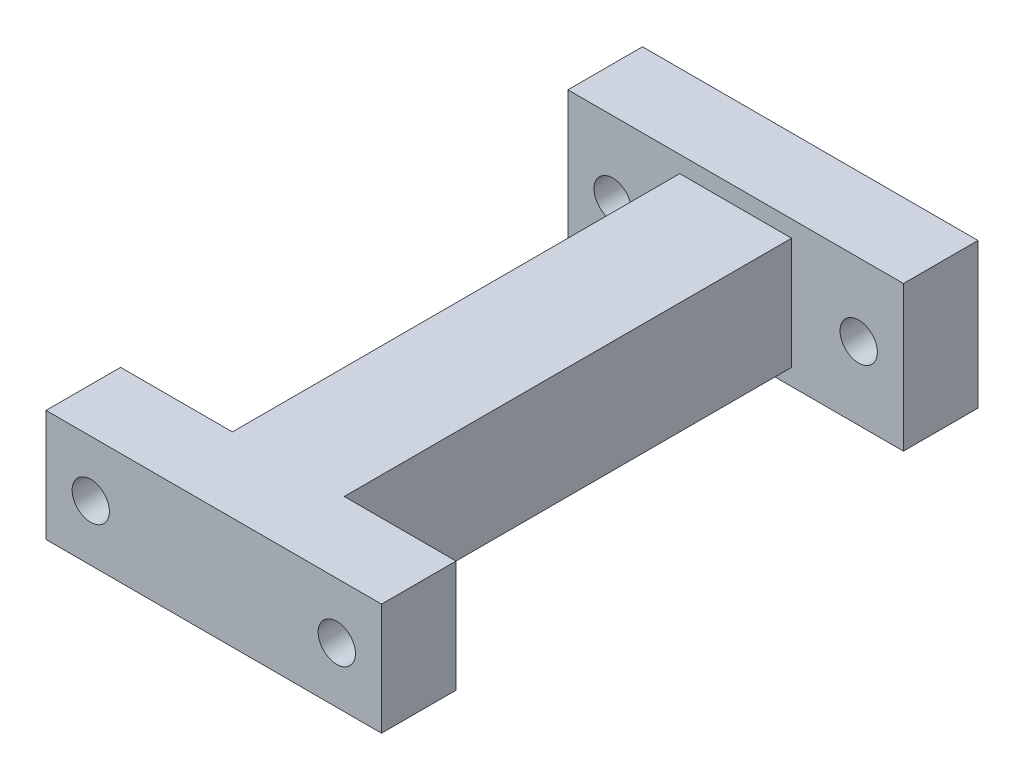
ISO-10303-21;
HEADER;
FILE_DESCRIPTION(('STEP AP214'),'2;1');
FILE_NAME('part.step','',(''),(''),'','','');
FILE_SCHEMA(('AUTOMOTIVE_DESIGN { 1 0 10303 214 1 1 1 1 }'));
ENDSEC;
DATA;
#1=APPLICATION_CONTEXT('core data for automotive mechanical design processes');
#2=APPLICATION_PROTOCOL_DEFINITION('international standard','automotive_design',2000,#1);
#3=PRODUCT_CONTEXT('',#1,'mechanical');
#4=PRODUCT('Part','Part','',(#3));
#5=PRODUCT_RELATED_PRODUCT_CATEGORY('part','',(#4));
#6=PRODUCT_DEFINITION_FORMATION('','',#4);
#7=PRODUCT_DEFINITION_CONTEXT('part definition',#1,'design');
#8=PRODUCT_DEFINITION('design','',#6,#7);
#9=PRODUCT_DEFINITION_SHAPE('','',#8);
#10=(LENGTH_UNIT() NAMED_UNIT(*) SI_UNIT(.MILLI.,.METRE.));
#11=(NAMED_UNIT(*) PLANE_ANGLE_UNIT() SI_UNIT($,.RADIAN.));
#12=(NAMED_UNIT(*) SI_UNIT($,.STERADIAN.) SOLID_ANGLE_UNIT());
#13=UNCERTAINTY_MEASURE_WITH_UNIT(LENGTH_MEASURE(1.E-05),#10,'distance_accuracy_value','');
#14=(GEOMETRIC_REPRESENTATION_CONTEXT(3) GLOBAL_UNCERTAINTY_ASSIGNED_CONTEXT((#13)) GLOBAL_UNIT_ASSIGNED_CONTEXT((#10,
#11,#12)) REPRESENTATION_CONTEXT('',''));
#15=CARTESIAN_POINT('',(0.,0.,0.));
#16=DIRECTION('',(0.,0.,1.));
#17=DIRECTION('',(1.,0.,0.));
#18=AXIS2_PLACEMENT_3D('',#15,#16,#17);
#19=CARTESIAN_POINT('',(-7.5,-7.5,80.));
#20=DIRECTION('',(1.,0.,0.));
#21=DIRECTION('',(0.,0.,-1.));
#22=AXIS2_PLACEMENT_3D('',#19,#20,#21);
#23=PLANE('',#22);
#24=DIRECTION('',(0.,1.,0.));
#25=VECTOR('',#24,1.);
#26=CARTESIAN_POINT('',(-7.5,-7.5,9.99999999999999));
#27=LINE('',#26,#25);
#28=CARTESIAN_POINT('',(-7.5,-7.5,9.99999999999999));
#29=VERTEX_POINT('',#28);
#30=CARTESIAN_POINT('',(-7.5,7.5,9.99999999999999));
#31=VERTEX_POINT('',#30);
#32=EDGE_CURVE('E66',#29,#31,#27,.T.);
#33=ORIENTED_EDGE('',*,*,#32,.F.);
#34=DIRECTION('',(0.,0.,-1.));
#35=VECTOR('',#34,1.);
#36=CARTESIAN_POINT('',(-7.5,-7.5,80.));
#37=LINE('',#36,#35);
#38=CARTESIAN_POINT('',(-7.49999999999999,-7.5,70.));
#39=VERTEX_POINT('',#38);
#40=EDGE_CURVE('E51',#39,#29,#37,.T.);
#41=ORIENTED_EDGE('',*,*,#40,.F.);
#42=DIRECTION('',(0.,-1.,0.));
#43=VECTOR('',#42,1.);
#44=CARTESIAN_POINT('',(-7.5,-7.5,70.));
#45=LINE('',#44,#43);
#46=CARTESIAN_POINT('',(-7.49999999999999,7.5,70.));
#47=VERTEX_POINT('',#46);
#48=EDGE_CURVE('E256',#47,#39,#45,.T.);
#49=ORIENTED_EDGE('',*,*,#48,.F.);
#50=DIRECTION('',(0.,0.,-1.));
#51=VECTOR('',#50,1.);
#52=CARTESIAN_POINT('',(-7.5,7.5,80.));
#53=LINE('',#52,#51);
#54=EDGE_CURVE('E265',#47,#31,#53,.T.);
#55=ORIENTED_EDGE('',*,*,#54,.T.);
#56=EDGE_LOOP('',(#33,#41,#49,#55));
#57=FACE_BOUND('',#56,.T.);
#58=ADVANCED_FACE('F43',(#57),#23,.F.);
#59=CARTESIAN_POINT('',(7.5,-7.5,80.));
#60=DIRECTION('',(-1.,0.,0.));
#61=DIRECTION('',(0.,0.,1.));
#62=AXIS2_PLACEMENT_3D('',#59,#60,#61);
#63=PLANE('',#62);
#64=DIRECTION('',(0.,-1.,0.));
#65=VECTOR('',#64,1.);
#66=CARTESIAN_POINT('',(7.5,-7.5,9.99999999999999));
#67=LINE('',#66,#65);
#68=CARTESIAN_POINT('',(7.5,7.5,9.99999999999999));
#69=VERTEX_POINT('',#68);
#70=CARTESIAN_POINT('',(7.5,-7.5,9.99999999999999));
#71=VERTEX_POINT('',#70);
#72=EDGE_CURVE('E188',#69,#71,#67,.T.);
#73=ORIENTED_EDGE('',*,*,#72,.F.);
#74=DIRECTION('',(0.,0.,-1.));
#75=VECTOR('',#74,1.);
#76=CARTESIAN_POINT('',(7.5,7.5,80.));
#77=LINE('',#76,#75);
#78=CARTESIAN_POINT('',(7.5,7.5,70.));
#79=VERTEX_POINT('',#78);
#80=EDGE_CURVE('E268',#79,#69,#77,.T.);
#81=ORIENTED_EDGE('',*,*,#80,.F.);
#82=DIRECTION('',(0.,1.,0.));
#83=VECTOR('',#82,1.);
#84=CARTESIAN_POINT('',(7.5,-7.5,70.));
#85=LINE('',#84,#83);
#86=CARTESIAN_POINT('',(7.5,-7.5,70.));
#87=VERTEX_POINT('',#86);
#88=EDGE_CURVE('E242',#87,#79,#85,.T.);
#89=ORIENTED_EDGE('',*,*,#88,.F.);
#90=DIRECTION('',(0.,0.,-1.));
#91=VECTOR('',#90,1.);
#92=CARTESIAN_POINT('',(7.5,-7.5,80.));
#93=LINE('',#92,#91);
#94=EDGE_CURVE('E271',#87,#71,#93,.T.);
#95=ORIENTED_EDGE('',*,*,#94,.T.);
#96=EDGE_LOOP('',(#73,#81,#89,#95));
#97=FACE_BOUND('',#96,.T.);
#98=ADVANCED_FACE('F301',(#97),#63,.F.);
#99=CARTESIAN_POINT('',(7.5,-7.5,80.));
#100=DIRECTION('',(0.,1.,0.));
#101=DIRECTION('',(-1.,0.,0.));
#102=AXIS2_PLACEMENT_3D('',#99,#100,#101);
#103=PLANE('',#102);
#104=DIRECTION('',(-1.,0.,0.));
#105=VECTOR('',#104,1.);
#106=CARTESIAN_POINT('',(7.5,-7.5,9.99999999999999));
#107=LINE('',#106,#105);
#108=EDGE_CURVE('E58',#71,#29,#107,.T.);
#109=ORIENTED_EDGE('',*,*,#108,.F.);
#110=ORIENTED_EDGE('',*,*,#94,.F.);
#111=DIRECTION('',(1.,0.,0.));
#112=VECTOR('',#111,1.);
#113=CARTESIAN_POINT('',(22.5,-7.5,70.));
#114=LINE('',#113,#112);
#115=CARTESIAN_POINT('',(22.5,-7.5,70.));
#116=VERTEX_POINT('',#115);
#117=EDGE_CURVE('E214',#87,#116,#114,.T.);
#118=ORIENTED_EDGE('',*,*,#117,.T.);
#119=DIRECTION('',(0.,0.,1.));
#120=VECTOR('',#119,1.);
#121=CARTESIAN_POINT('',(22.5,-7.5,70.));
#122=LINE('',#121,#120);
#123=CARTESIAN_POINT('',(22.5,-7.5,80.));
#124=VERTEX_POINT('',#123);
#125=EDGE_CURVE('E247',#116,#124,#122,.T.);
#126=ORIENTED_EDGE('',*,*,#125,.T.);
#127=DIRECTION('',(1.,0.,0.));
#128=VECTOR('',#127,1.);
#129=CARTESIAN_POINT('',(7.5,-7.5,80.));
#130=LINE('',#129,#128);
#131=CARTESIAN_POINT('',(-22.5,-7.5,80.));
#132=VERTEX_POINT('',#131);
#133=EDGE_CURVE('E259',#132,#124,#130,.T.);
#134=ORIENTED_EDGE('',*,*,#133,.F.);
#135=DIRECTION('',(0.,0.,1.));
#136=VECTOR('',#135,1.);
#137=CARTESIAN_POINT('',(-22.5,-7.5,70.));
#138=LINE('',#137,#136);
#139=CARTESIAN_POINT('',(-22.5,-7.5,70.));
#140=VERTEX_POINT('',#139);
#141=EDGE_CURVE('E229',#140,#132,#138,.T.);
#142=ORIENTED_EDGE('',*,*,#141,.F.);
#143=EDGE_CURVE('E216',#140,#39,#114,.T.);
#144=ORIENTED_EDGE('',*,*,#143,.T.);
#145=ORIENTED_EDGE('',*,*,#40,.T.);
#146=EDGE_LOOP('',(#109,#110,#118,#126,#134,#142,#144,#145));
#147=FACE_BOUND('',#146,.T.);
#148=ADVANCED_FACE('F305',(#147),#103,.F.);
#149=CARTESIAN_POINT('',(7.5,7.5,80.));
#150=DIRECTION('',(0.,-1.,0.));
#151=DIRECTION('',(1.,0.,0.));
#152=AXIS2_PLACEMENT_3D('',#149,#150,#151);
#153=PLANE('',#152);
#154=DIRECTION('',(1.,0.,0.));
#155=VECTOR('',#154,1.);
#156=CARTESIAN_POINT('',(7.5,7.5,9.99999999999999));
#157=LINE('',#156,#155);
#158=EDGE_CURVE('E11',#31,#69,#157,.T.);
#159=ORIENTED_EDGE('',*,*,#158,.F.);
#160=ORIENTED_EDGE('',*,*,#54,.F.);
#161=DIRECTION('',(-1.,0.,0.));
#162=VECTOR('',#161,1.);
#163=CARTESIAN_POINT('',(22.5,7.5,70.));
#164=LINE('',#163,#162);
#165=CARTESIAN_POINT('',(-22.5,7.5,70.));
#166=VERTEX_POINT('',#165);
#167=EDGE_CURVE('E224',#47,#166,#164,.T.);
#168=ORIENTED_EDGE('',*,*,#167,.T.);
#169=DIRECTION('',(0.,0.,1.));
#170=VECTOR('',#169,1.);
#171=CARTESIAN_POINT('',(-22.5,7.5,70.));
#172=LINE('',#171,#170);
#173=CARTESIAN_POINT('',(-22.5,7.5,80.));
#174=VERTEX_POINT('',#173);
#175=EDGE_CURVE('E238',#166,#174,#172,.T.);
#176=ORIENTED_EDGE('',*,*,#175,.T.);
#177=DIRECTION('',(-1.,0.,0.));
#178=VECTOR('',#177,1.);
#179=CARTESIAN_POINT('',(7.5,7.5,80.));
#180=LINE('',#179,#178);
#181=CARTESIAN_POINT('',(22.5,7.5,80.));
#182=VERTEX_POINT('',#181);
#183=EDGE_CURVE('E262',#182,#174,#180,.T.);
#184=ORIENTED_EDGE('',*,*,#183,.F.);
#185=DIRECTION('',(0.,0.,1.));
#186=VECTOR('',#185,1.);
#187=CARTESIAN_POINT('',(22.5,7.5,70.));
#188=LINE('',#187,#186);
#189=CARTESIAN_POINT('',(22.5,7.5,70.));
#190=VERTEX_POINT('',#189);
#191=EDGE_CURVE('E243',#190,#182,#188,.T.);
#192=ORIENTED_EDGE('',*,*,#191,.F.);
#193=EDGE_CURVE('E225',#190,#79,#164,.T.);
#194=ORIENTED_EDGE('',*,*,#193,.T.);
#195=ORIENTED_EDGE('',*,*,#80,.T.);
#196=EDGE_LOOP('',(#159,#160,#168,#176,#184,#192,#194,#195));
#197=FACE_BOUND('',#196,.T.);
#198=ADVANCED_FACE('F311',(#197),#153,.F.);
#199=CARTESIAN_POINT('',(0.,0.,80.));
#200=DIRECTION('',(0.,0.,1.));
#201=DIRECTION('',(1.,0.,0.));
#202=AXIS2_PLACEMENT_3D('',#199,#200,#201);
#203=PLANE('',#202);
#204=CARTESIAN_POINT('',(-16.5,0.,80.));
#205=DIRECTION('',(0.,0.,1.));
#206=DIRECTION('',(1.,0.,0.));
#207=AXIS2_PLACEMENT_3D('',#204,#205,#206);
#208=CIRCLE('',#207,2.5);
#209=CARTESIAN_POINT('',(-14.,0.,80.));
#210=VERTEX_POINT('',#209);
#211=EDGE_CURVE('E202',#210,#210,#208,.T.);
#212=ORIENTED_EDGE('',*,*,#211,.F.);
#213=EDGE_LOOP('',(#212));
#214=FACE_BOUND('',#213,.T.);
#215=CARTESIAN_POINT('',(16.5,0.,80.));
#216=DIRECTION('',(0.,0.,1.));
#217=DIRECTION('',(-1.,0.,0.));
#218=AXIS2_PLACEMENT_3D('',#215,#216,#217);
#219=CIRCLE('',#218,2.5);
#220=CARTESIAN_POINT('',(14.,0.,80.));
#221=VERTEX_POINT('',#220);
#222=EDGE_CURVE('E201',#221,#221,#219,.T.);
#223=ORIENTED_EDGE('',*,*,#222,.F.);
#224=EDGE_LOOP('',(#223));
#225=FACE_BOUND('',#224,.T.);
#226=ORIENTED_EDGE('',*,*,#183,.T.);
#227=DIRECTION('',(0.,-1.,0.));
#228=VECTOR('',#227,1.);
#229=CARTESIAN_POINT('',(-22.5,-7.5,80.));
#230=LINE('',#229,#228);
#231=EDGE_CURVE('E230',#174,#132,#230,.T.);
#232=ORIENTED_EDGE('',*,*,#231,.T.);
#233=ORIENTED_EDGE('',*,*,#133,.T.);
#234=DIRECTION('',(0.,1.,0.));
#235=VECTOR('',#234,1.);
#236=CARTESIAN_POINT('',(22.5,-7.5,80.));
#237=LINE('',#236,#235);
#238=EDGE_CURVE('E215',#124,#182,#237,.T.);
#239=ORIENTED_EDGE('',*,*,#238,.T.);
#240=EDGE_LOOP('',(#226,#232,#233,#239));
#241=FACE_BOUND('',#240,.T.);
#242=ADVANCED_FACE('F316',(#214,#225,#241),#203,.T.);
#243=CARTESIAN_POINT('',(22.5,-7.5,70.));
#244=DIRECTION('',(1.,0.,0.));
#245=DIRECTION('',(0.,0.,-1.));
#246=AXIS2_PLACEMENT_3D('',#243,#244,#245);
#247=PLANE('',#246);
#248=ORIENTED_EDGE('',*,*,#238,.F.);
#249=ORIENTED_EDGE('',*,*,#125,.F.);
#250=DIRECTION('',(0.,1.,0.));
#251=VECTOR('',#250,1.);
#252=CARTESIAN_POINT('',(22.5,-7.5,70.));
#253=LINE('',#252,#251);
#254=EDGE_CURVE('E220',#116,#190,#253,.T.);
#255=ORIENTED_EDGE('',*,*,#254,.T.);
#256=ORIENTED_EDGE('',*,*,#191,.T.);
#257=EDGE_LOOP('',(#248,#249,#255,#256));
#258=FACE_BOUND('',#257,.T.);
#259=ADVANCED_FACE('F325',(#258),#247,.T.);
#260=CARTESIAN_POINT('',(0.,0.,70.));
#261=DIRECTION('',(0.,0.,1.));
#262=DIRECTION('',(1.,0.,0.));
#263=AXIS2_PLACEMENT_3D('',#260,#261,#262);
#264=PLANE('',#263);
#265=CARTESIAN_POINT('',(16.5,0.,70.));
#266=DIRECTION('',(0.,0.,1.));
#267=DIRECTION('',(1.,0.,0.));
#268=AXIS2_PLACEMENT_3D('',#265,#266,#267);
#269=CIRCLE('',#268,2.5);
#270=CARTESIAN_POINT('',(19.,0.,70.));
#271=VERTEX_POINT('',#270);
#272=EDGE_CURVE('E234',#271,#271,#269,.T.);
#273=ORIENTED_EDGE('',*,*,#272,.T.);
#274=EDGE_LOOP('',(#273));
#275=FACE_BOUND('',#274,.T.);
#276=ORIENTED_EDGE('',*,*,#117,.F.);
#277=ORIENTED_EDGE('',*,*,#88,.T.);
#278=ORIENTED_EDGE('',*,*,#193,.F.);
#279=ORIENTED_EDGE('',*,*,#254,.F.);
#280=EDGE_LOOP('',(#276,#277,#278,#279));
#281=FACE_BOUND('',#280,.T.);
#282=ADVANCED_FACE('F282',(#275,#281),#264,.F.);
#283=CARTESIAN_POINT('',(-16.5,0.,70.));
#284=DIRECTION('',(0.,0.,1.));
#285=DIRECTION('',(1.,0.,0.));
#286=AXIS2_PLACEMENT_3D('',#283,#284,#285);
#287=CIRCLE('',#286,2.5);
#288=CARTESIAN_POINT('',(-14.,0.,70.));
#289=VERTEX_POINT('',#288);
#290=EDGE_CURVE('E206',#289,#289,#287,.T.);
#291=ORIENTED_EDGE('',*,*,#290,.T.);
#292=EDGE_LOOP('',(#291));
#293=FACE_BOUND('',#292,.T.);
#294=ORIENTED_EDGE('',*,*,#167,.F.);
#295=ORIENTED_EDGE('',*,*,#48,.T.);
#296=ORIENTED_EDGE('',*,*,#143,.F.);
#297=DIRECTION('',(0.,-1.,0.));
#298=VECTOR('',#297,1.);
#299=CARTESIAN_POINT('',(-22.5,-7.5,70.));
#300=LINE('',#299,#298);
#301=EDGE_CURVE('E210',#166,#140,#300,.T.);
#302=ORIENTED_EDGE('',*,*,#301,.F.);
#303=EDGE_LOOP('',(#294,#295,#296,#302));
#304=FACE_BOUND('',#303,.T.);
#305=ADVANCED_FACE('F329',(#293,#304),#264,.F.);
#306=CARTESIAN_POINT('',(-22.5,-7.5,70.));
#307=DIRECTION('',(-1.,0.,0.));
#308=DIRECTION('',(0.,0.,1.));
#309=AXIS2_PLACEMENT_3D('',#306,#307,#308);
#310=PLANE('',#309);
#311=ORIENTED_EDGE('',*,*,#231,.F.);
#312=ORIENTED_EDGE('',*,*,#175,.F.);
#313=ORIENTED_EDGE('',*,*,#301,.T.);
#314=ORIENTED_EDGE('',*,*,#141,.T.);
#315=EDGE_LOOP('',(#311,#312,#313,#314));
#316=FACE_BOUND('',#315,.T.);
#317=ADVANCED_FACE('F296',(#316),#310,.T.);
#318=CARTESIAN_POINT('',(-16.5,0.,60.));
#319=DIRECTION('',(0.,0.,1.));
#320=DIRECTION('',(1.,0.,0.));
#321=AXIS2_PLACEMENT_3D('',#318,#319,#320);
#322=CYLINDRICAL_SURFACE('',#321,2.5);
#323=ORIENTED_EDGE('',*,*,#211,.T.);
#324=EDGE_LOOP('',(#323));
#325=FACE_BOUND('',#324,.T.);
#326=ORIENTED_EDGE('',*,*,#290,.F.);
#327=EDGE_LOOP('',(#326));
#328=FACE_BOUND('',#327,.T.);
#329=ADVANCED_FACE('F287',(#325,#328),#322,.F.);
#330=CARTESIAN_POINT('',(16.5,0.,60.));
#331=DIRECTION('',(0.,0.,1.));
#332=DIRECTION('',(1.,0.,0.));
#333=AXIS2_PLACEMENT_3D('',#330,#331,#332);
#334=CYLINDRICAL_SURFACE('',#333,2.5);
#335=ORIENTED_EDGE('',*,*,#222,.T.);
#336=EDGE_LOOP('',(#335));
#337=FACE_BOUND('',#336,.T.);
#338=ORIENTED_EDGE('',*,*,#272,.F.);
#339=EDGE_LOOP('',(#338));
#340=FACE_BOUND('',#339,.T.);
#341=ADVANCED_FACE('F285',(#337,#340),#334,.F.);
#342=CARTESIAN_POINT('',(0.,0.,10.));
#343=DIRECTION('',(0.,0.,-1.));
#344=DIRECTION('',(-1.,0.,0.));
#345=AXIS2_PLACEMENT_3D('',#342,#343,#344);
#346=PLANE('',#345);
#347=CARTESIAN_POINT('',(16.5,0.,9.99999999999999));
#348=DIRECTION('',(0.,0.,-1.));
#349=DIRECTION('',(-1.,0.,0.));
#350=AXIS2_PLACEMENT_3D('',#347,#348,#349);
#351=CIRCLE('',#350,2.5);
#352=CARTESIAN_POINT('',(14.,0.,9.99999999999999));
#353=VERTEX_POINT('',#352);
#354=EDGE_CURVE('E171',#353,#353,#351,.T.);
#355=ORIENTED_EDGE('',*,*,#354,.T.);
#356=EDGE_LOOP('',(#355));
#357=FACE_BOUND('',#356,.T.);
#358=CARTESIAN_POINT('',(-16.5,0.,9.99999999999999));
#359=DIRECTION('',(0.,0.,-1.));
#360=DIRECTION('',(-1.,0.,0.));
#361=AXIS2_PLACEMENT_3D('',#358,#359,#360);
#362=CIRCLE('',#361,2.5);
#363=CARTESIAN_POINT('',(-19.,0.,9.99999999999999));
#364=VERTEX_POINT('',#363);
#365=EDGE_CURVE('E540',#364,#364,#362,.T.);
#366=ORIENTED_EDGE('',*,*,#365,.T.);
#367=EDGE_LOOP('',(#366));
#368=FACE_BOUND('',#367,.T.);
#369=DIRECTION('',(0.,-1.,0.));
#370=VECTOR('',#369,1.);
#371=CARTESIAN_POINT('',(22.5,-9.73638284610195,10.));
#372=LINE('',#371,#370);
#373=CARTESIAN_POINT('',(22.5,9.73638284610195,10.));
#374=VERTEX_POINT('',#373);
#375=CARTESIAN_POINT('',(22.5,-9.73638284610195,10.));
#376=VERTEX_POINT('',#375);
#377=EDGE_CURVE('E155',#374,#376,#372,.T.);
#378=ORIENTED_EDGE('',*,*,#377,.F.);
#379=DIRECTION('',(1.,0.,0.));
#380=VECTOR('',#379,1.);
#381=CARTESIAN_POINT('',(-22.5,9.73638284610195,10.));
#382=LINE('',#381,#380);
#383=CARTESIAN_POINT('',(-22.5,9.73638284610195,10.));
#384=VERTEX_POINT('',#383);
#385=EDGE_CURVE('E147',#384,#374,#382,.T.);
#386=ORIENTED_EDGE('',*,*,#385,.F.);
#387=DIRECTION('',(0.,1.,0.));
#388=VECTOR('',#387,1.);
#389=CARTESIAN_POINT('',(-22.5,-9.73638284610194,10.));
#390=LINE('',#389,#388);
#391=CARTESIAN_POINT('',(-22.5,-9.73638284610194,10.));
#392=VERTEX_POINT('',#391);
#393=EDGE_CURVE('E158',#392,#384,#390,.T.);
#394=ORIENTED_EDGE('',*,*,#393,.F.);
#395=DIRECTION('',(-1.,0.,0.));
#396=VECTOR('',#395,1.);
#397=CARTESIAN_POINT('',(-22.5,-9.73638284610194,10.));
#398=LINE('',#397,#396);
#399=EDGE_CURVE('E138',#376,#392,#398,.T.);
#400=ORIENTED_EDGE('',*,*,#399,.F.);
#401=EDGE_LOOP('',(#378,#386,#394,#400));
#402=FACE_BOUND('',#401,.T.);
#403=ORIENTED_EDGE('',*,*,#72,.T.);
#404=ORIENTED_EDGE('',*,*,#108,.T.);
#405=ORIENTED_EDGE('',*,*,#32,.T.);
#406=ORIENTED_EDGE('',*,*,#158,.T.);
#407=EDGE_LOOP('',(#403,#404,#405,#406));
#408=FACE_BOUND('',#407,.T.);
#409=ADVANCED_FACE('F152',(#357,#368,#402,#408),#346,.F.);
#410=CARTESIAN_POINT('',(22.5,-9.73638284610195,10.));
#411=DIRECTION('',(1.,0.,0.));
#412=DIRECTION('',(0.,0.,-1.));
#413=AXIS2_PLACEMENT_3D('',#410,#411,#412);
#414=PLANE('',#413);
#415=DIRECTION('',(0.,-1.,0.));
#416=VECTOR('',#415,1.);
#417=CARTESIAN_POINT('',(22.5,-9.73638284610195,0.));
#418=LINE('',#417,#416);
#419=CARTESIAN_POINT('',(22.5,9.73638284610195,0.));
#420=VERTEX_POINT('',#419);
#421=CARTESIAN_POINT('',(22.5,-9.73638284610195,0.));
#422=VERTEX_POINT('',#421);
#423=EDGE_CURVE('E178',#420,#422,#418,.T.);
#424=ORIENTED_EDGE('',*,*,#423,.F.);
#425=DIRECTION('',(0.,0.,-1.));
#426=VECTOR('',#425,1.);
#427=CARTESIAN_POINT('',(22.5,9.73638284610195,10.));
#428=LINE('',#427,#426);
#429=EDGE_CURVE('E162',#374,#420,#428,.T.);
#430=ORIENTED_EDGE('',*,*,#429,.F.);
#431=ORIENTED_EDGE('',*,*,#377,.T.);
#432=DIRECTION('',(0.,0.,-1.));
#433=VECTOR('',#432,1.);
#434=CARTESIAN_POINT('',(22.5,-9.73638284610195,10.));
#435=LINE('',#434,#433);
#436=EDGE_CURVE('E135',#376,#422,#435,.T.);
#437=ORIENTED_EDGE('',*,*,#436,.T.);
#438=EDGE_LOOP('',(#424,#430,#431,#437));
#439=FACE_BOUND('',#438,.T.);
#440=ADVANCED_FACE('F161',(#439),#414,.T.);
#441=CARTESIAN_POINT('',(-22.5,9.73638284610195,10.));
#442=DIRECTION('',(0.,1.,0.));
#443=DIRECTION('',(-1.,0.,0.));
#444=AXIS2_PLACEMENT_3D('',#441,#442,#443);
#445=PLANE('',#444);
#446=DIRECTION('',(1.,0.,0.));
#447=VECTOR('',#446,1.);
#448=CARTESIAN_POINT('',(-22.5,9.73638284610195,0.));
#449=LINE('',#448,#447);
#450=CARTESIAN_POINT('',(-22.5,9.73638284610195,0.));
#451=VERTEX_POINT('',#450);
#452=EDGE_CURVE('E164',#451,#420,#449,.T.);
#453=ORIENTED_EDGE('',*,*,#452,.F.);
#454=DIRECTION('',(0.,0.,-1.));
#455=VECTOR('',#454,1.);
#456=CARTESIAN_POINT('',(-22.5,9.73638284610195,10.));
#457=LINE('',#456,#455);
#458=EDGE_CURVE('E189',#384,#451,#457,.T.);
#459=ORIENTED_EDGE('',*,*,#458,.F.);
#460=ORIENTED_EDGE('',*,*,#385,.T.);
#461=ORIENTED_EDGE('',*,*,#429,.T.);
#462=EDGE_LOOP('',(#453,#459,#460,#461));
#463=FACE_BOUND('',#462,.T.);
#464=ADVANCED_FACE('F494',(#463),#445,.T.);
#465=CARTESIAN_POINT('',(-22.5,-9.73638284610194,10.));
#466=DIRECTION('',(-1.,0.,0.));
#467=DIRECTION('',(0.,0.,1.));
#468=AXIS2_PLACEMENT_3D('',#465,#466,#467);
#469=PLANE('',#468);
#470=DIRECTION('',(0.,1.,0.));
#471=VECTOR('',#470,1.);
#472=CARTESIAN_POINT('',(-22.5,-9.73638284610194,0.));
#473=LINE('',#472,#471);
#474=CARTESIAN_POINT('',(-22.5,-9.73638284610194,0.));
#475=VERTEX_POINT('',#474);
#476=EDGE_CURVE('E168',#475,#451,#473,.T.);
#477=ORIENTED_EDGE('',*,*,#476,.F.);
#478=DIRECTION('',(0.,0.,-1.));
#479=VECTOR('',#478,1.);
#480=CARTESIAN_POINT('',(-22.5,-9.73638284610194,10.));
#481=LINE('',#480,#479);
#482=EDGE_CURVE('E146',#392,#475,#481,.T.);
#483=ORIENTED_EDGE('',*,*,#482,.F.);
#484=ORIENTED_EDGE('',*,*,#393,.T.);
#485=ORIENTED_EDGE('',*,*,#458,.T.);
#486=EDGE_LOOP('',(#477,#483,#484,#485));
#487=FACE_BOUND('',#486,.T.);
#488=ADVANCED_FACE('F488',(#487),#469,.T.);
#489=CARTESIAN_POINT('',(-22.5,-9.73638284610194,10.));
#490=DIRECTION('',(0.,-1.,0.));
#491=DIRECTION('',(1.,0.,0.));
#492=AXIS2_PLACEMENT_3D('',#489,#490,#491);
#493=PLANE('',#492);
#494=DIRECTION('',(-1.,0.,0.));
#495=VECTOR('',#494,1.);
#496=CARTESIAN_POINT('',(-22.5,-9.73638284610194,0.));
#497=LINE('',#496,#495);
#498=EDGE_CURVE('E140',#422,#475,#497,.T.);
#499=ORIENTED_EDGE('',*,*,#498,.F.);
#500=ORIENTED_EDGE('',*,*,#436,.F.);
#501=ORIENTED_EDGE('',*,*,#399,.T.);
#502=ORIENTED_EDGE('',*,*,#482,.T.);
#503=EDGE_LOOP('',(#499,#500,#501,#502));
#504=FACE_BOUND('',#503,.T.);
#505=ADVANCED_FACE('F137',(#504),#493,.T.);
#506=CARTESIAN_POINT('',(0.,0.,0.));
#507=DIRECTION('',(0.,0.,1.));
#508=DIRECTION('',(1.,0.,0.));
#509=AXIS2_PLACEMENT_3D('',#506,#507,#508);
#510=PLANE('',#509);
#511=CARTESIAN_POINT('',(16.5,0.,0.));
#512=DIRECTION('',(0.,0.,-1.));
#513=DIRECTION('',(-1.,0.,0.));
#514=AXIS2_PLACEMENT_3D('',#511,#512,#513);
#515=CIRCLE('',#514,2.5);
#516=CARTESIAN_POINT('',(14.,0.,0.));
#517=VERTEX_POINT('',#516);
#518=EDGE_CURVE('E536',#517,#517,#515,.T.);
#519=ORIENTED_EDGE('',*,*,#518,.F.);
#520=EDGE_LOOP('',(#519));
#521=FACE_BOUND('',#520,.T.);
#522=CARTESIAN_POINT('',(-16.5,0.,0.));
#523=DIRECTION('',(0.,0.,-1.));
#524=DIRECTION('',(-1.,0.,0.));
#525=AXIS2_PLACEMENT_3D('',#522,#523,#524);
#526=CIRCLE('',#525,2.5);
#527=CARTESIAN_POINT('',(-19.,0.,0.));
#528=VERTEX_POINT('',#527);
#529=EDGE_CURVE('E546',#528,#528,#526,.T.);
#530=ORIENTED_EDGE('',*,*,#529,.F.);
#531=EDGE_LOOP('',(#530));
#532=FACE_BOUND('',#531,.T.);
#533=ORIENTED_EDGE('',*,*,#423,.T.);
#534=ORIENTED_EDGE('',*,*,#498,.T.);
#535=ORIENTED_EDGE('',*,*,#476,.T.);
#536=ORIENTED_EDGE('',*,*,#452,.T.);
#537=EDGE_LOOP('',(#533,#534,#535,#536));
#538=FACE_BOUND('',#537,.T.);
#539=ADVANCED_FACE('F318',(#521,#532,#538),#510,.F.);
#540=CARTESIAN_POINT('',(-16.5,0.,80.));
#541=DIRECTION('',(0.,0.,-1.));
#542=DIRECTION('',(-1.,0.,0.));
#543=AXIS2_PLACEMENT_3D('',#540,#541,#542);
#544=CYLINDRICAL_SURFACE('',#543,2.5);
#545=ORIENTED_EDGE('',*,*,#529,.T.);
#546=EDGE_LOOP('',(#545));
#547=FACE_BOUND('',#546,.T.);
#548=ORIENTED_EDGE('',*,*,#365,.F.);
#549=EDGE_LOOP('',(#548));
#550=FACE_BOUND('',#549,.T.);
#551=ADVANCED_FACE('F321',(#547,#550),#544,.F.);
#552=CARTESIAN_POINT('',(16.5,0.,80.));
#553=DIRECTION('',(0.,0.,-1.));
#554=DIRECTION('',(-1.,0.,0.));
#555=AXIS2_PLACEMENT_3D('',#552,#553,#554);
#556=CYLINDRICAL_SURFACE('',#555,2.5);
#557=ORIENTED_EDGE('',*,*,#518,.T.);
#558=EDGE_LOOP('',(#557));
#559=FACE_BOUND('',#558,.T.);
#560=ORIENTED_EDGE('',*,*,#354,.F.);
#561=EDGE_LOOP('',(#560));
#562=FACE_BOUND('',#561,.T.);
#563=ADVANCED_FACE('F468',(#559,#562),#556,.F.);
#564=CLOSED_SHELL('',(#58,#98,#148,#198,#242,#259,#282,#305,#317,#329,#341,#409,#440,#464,#488,
#505,#539,#551,#563));
#565=MANIFOLD_SOLID_BREP('B2',#564);
#566=ADVANCED_BREP_SHAPE_REPRESENTATION('',(#18,#565),#14);
#567=SHAPE_DEFINITION_REPRESENTATION(#9,#566);
ENDSEC;
END-ISO-10303-21;
